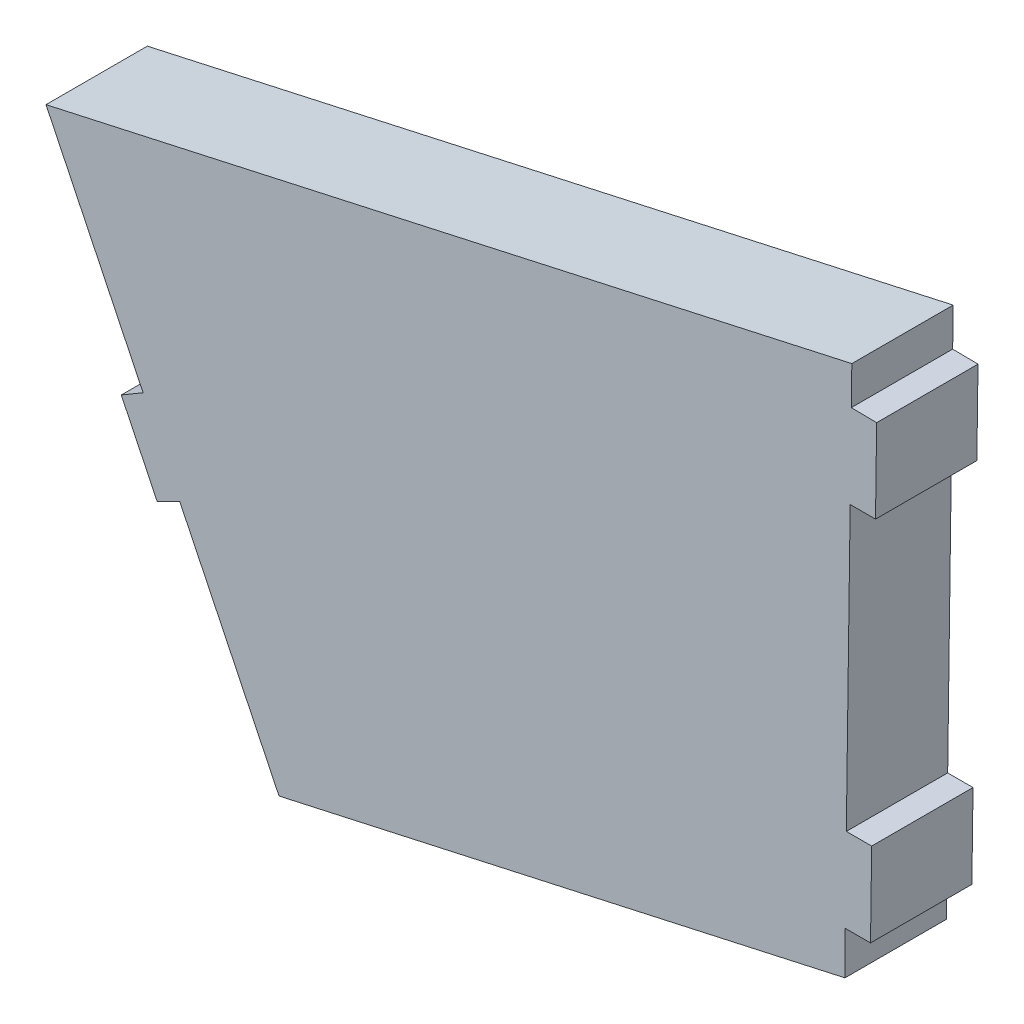
ISO-10303-21;
HEADER;
FILE_DESCRIPTION(('STEP AP214'),'2;1');
FILE_NAME('part.step','',(''),(''),'','','');
FILE_SCHEMA(('AUTOMOTIVE_DESIGN { 1 0 10303 214 1 1 1 1 }'));
ENDSEC;
DATA;
#1=APPLICATION_CONTEXT('core data for automotive mechanical design processes');
#2=APPLICATION_PROTOCOL_DEFINITION('international standard','automotive_design',2000,#1);
#3=PRODUCT_CONTEXT('',#1,'mechanical');
#4=PRODUCT('Part','Part','',(#3));
#5=PRODUCT_RELATED_PRODUCT_CATEGORY('part','',(#4));
#6=PRODUCT_DEFINITION_FORMATION('','',#4);
#7=PRODUCT_DEFINITION_CONTEXT('part definition',#1,'design');
#8=PRODUCT_DEFINITION('design','',#6,#7);
#9=PRODUCT_DEFINITION_SHAPE('','',#8);
#10=(LENGTH_UNIT() NAMED_UNIT(*) SI_UNIT(.MILLI.,.METRE.));
#11=(NAMED_UNIT(*) PLANE_ANGLE_UNIT() SI_UNIT($,.RADIAN.));
#12=(NAMED_UNIT(*) SI_UNIT($,.STERADIAN.) SOLID_ANGLE_UNIT());
#13=UNCERTAINTY_MEASURE_WITH_UNIT(LENGTH_MEASURE(1.E-05),#10,'distance_accuracy_value','');
#14=(GEOMETRIC_REPRESENTATION_CONTEXT(3) GLOBAL_UNCERTAINTY_ASSIGNED_CONTEXT((#13)) GLOBAL_UNIT_ASSIGNED_CONTEXT((#10,
#11,#12)) REPRESENTATION_CONTEXT('',''));
#15=CARTESIAN_POINT('',(0.,0.,0.));
#16=DIRECTION('',(0.,0.,1.));
#17=DIRECTION('',(1.,0.,0.));
#18=AXIS2_PLACEMENT_3D('',#15,#16,#17);
#19=CARTESIAN_POINT('',(-46.4576192800978,110.716729862106,6.));
#20=DIRECTION('',(-0.900391954449664,-0.435079680475098,0.));
#21=DIRECTION('',(0.435079680475098,-0.900391954449664,0.));
#22=AXIS2_PLACEMENT_3D('',#19,#20,#21);
#23=PLANE('',#22);
#24=DIRECTION('',(-0.435079680475098,0.900391954449664,0.));
#25=VECTOR('',#24,1.);
#26=CARTESIAN_POINT('',(-46.4576192800978,110.716729862106,0.));
#27=LINE('',#26,#25);
#28=CARTESIAN_POINT('',(-46.4576192800978,110.716729862106,0.));
#29=VERTEX_POINT('',#28);
#30=CARTESIAN_POINT('',(-52.2054470827535,122.611787575263,0.));
#31=VERTEX_POINT('',#30);
#32=EDGE_CURVE('E210',#29,#31,#27,.T.);
#33=ORIENTED_EDGE('',*,*,#32,.F.);
#34=DIRECTION('',(0.,0.,-1.));
#35=VECTOR('',#34,1.);
#36=CARTESIAN_POINT('',(-46.4576192800978,110.716729862106,6.));
#37=LINE('',#36,#35);
#38=CARTESIAN_POINT('',(-46.4576192800978,110.716729862106,6.));
#39=VERTEX_POINT('',#38);
#40=EDGE_CURVE('E11',#39,#29,#37,.T.);
#41=ORIENTED_EDGE('',*,*,#40,.F.);
#42=DIRECTION('',(-0.435079680475098,0.900391954449664,0.));
#43=VECTOR('',#42,1.);
#44=CARTESIAN_POINT('',(-46.4576192800978,110.716729862106,6.));
#45=LINE('',#44,#43);
#46=CARTESIAN_POINT('',(-52.2054470827535,122.611787575263,6.));
#47=VERTEX_POINT('',#46);
#48=EDGE_CURVE('E266',#39,#47,#45,.T.);
#49=ORIENTED_EDGE('',*,*,#48,.T.);
#50=DIRECTION('',(0.,0.,-1.));
#51=VECTOR('',#50,1.);
#52=CARTESIAN_POINT('',(-52.2054470827535,122.611787575263,6.));
#53=LINE('',#52,#51);
#54=EDGE_CURVE('E42',#47,#31,#53,.T.);
#55=ORIENTED_EDGE('',*,*,#54,.T.);
#56=EDGE_LOOP('',(#33,#41,#49,#55));
#57=FACE_BOUND('',#56,.T.);
#58=ADVANCED_FACE('F39',(#57),#23,.T.);
#59=CARTESIAN_POINT('',(-47.7493632714953,109.954235625611,6.));
#60=DIRECTION('',(-0.508329490996837,0.861162660931659,0.));
#61=DIRECTION('',(-0.86116266093166,-0.508329490996837,0.));
#62=AXIS2_PLACEMENT_3D('',#59,#60,#61);
#63=PLANE('',#62);
#64=DIRECTION('',(0.86116266093166,0.508329490996837,0.));
#65=VECTOR('',#64,1.);
#66=CARTESIAN_POINT('',(-47.7493632714953,109.954235625611,0.));
#67=LINE('',#66,#65);
#68=CARTESIAN_POINT('',(-47.7493632714953,109.954235625611,0.));
#69=VERTEX_POINT('',#68);
#70=EDGE_CURVE('E264',#69,#29,#67,.T.);
#71=ORIENTED_EDGE('',*,*,#70,.F.);
#72=DIRECTION('',(0.,0.,-1.));
#73=VECTOR('',#72,1.);
#74=CARTESIAN_POINT('',(-47.7493632714953,109.954235625611,6.));
#75=LINE('',#74,#73);
#76=CARTESIAN_POINT('',(-47.7493632714953,109.954235625611,6.));
#77=VERTEX_POINT('',#76);
#78=EDGE_CURVE('E49',#77,#69,#75,.T.);
#79=ORIENTED_EDGE('',*,*,#78,.F.);
#80=DIRECTION('',(0.86116266093166,0.508329490996837,0.));
#81=VECTOR('',#80,1.);
#82=CARTESIAN_POINT('',(-47.7493632714953,109.954235625611,6.));
#83=LINE('',#82,#81);
#84=EDGE_CURVE('E196',#77,#39,#83,.T.);
#85=ORIENTED_EDGE('',*,*,#84,.T.);
#86=ORIENTED_EDGE('',*,*,#40,.T.);
#87=EDGE_LOOP('',(#71,#79,#85,#86));
#88=FACE_BOUND('',#87,.T.);
#89=ADVANCED_FACE('F303',(#88),#63,.T.);
#90=CARTESIAN_POINT('',(-45.6281462630315,105.564403570073,6.));
#91=DIRECTION('',(-0.900391954449663,-0.4350796804751,0.));
#92=DIRECTION('',(0.4350796804751,-0.900391954449664,0.));
#93=AXIS2_PLACEMENT_3D('',#90,#91,#92);
#94=PLANE('',#93);
#95=DIRECTION('',(-0.4350796804751,0.900391954449663,0.));
#96=VECTOR('',#95,1.);
#97=CARTESIAN_POINT('',(-45.6281462630315,105.564403570073,0.));
#98=LINE('',#97,#96);
#99=CARTESIAN_POINT('',(-45.6281462630315,105.564403570073,0.));
#100=VERTEX_POINT('',#99);
#101=EDGE_CURVE('E182',#100,#69,#98,.T.);
#102=ORIENTED_EDGE('',*,*,#101,.F.);
#103=DIRECTION('',(0.,0.,-1.));
#104=VECTOR('',#103,1.);
#105=CARTESIAN_POINT('',(-45.6281462630315,105.564403570073,6.));
#106=LINE('',#105,#104);
#107=CARTESIAN_POINT('',(-45.6281462630315,105.564403570073,6.));
#108=VERTEX_POINT('',#107);
#109=EDGE_CURVE('E177',#108,#100,#106,.T.);
#110=ORIENTED_EDGE('',*,*,#109,.F.);
#111=DIRECTION('',(-0.4350796804751,0.900391954449663,0.));
#112=VECTOR('',#111,1.);
#113=CARTESIAN_POINT('',(-45.6281462630315,105.564403570073,6.));
#114=LINE('',#113,#112);
#115=EDGE_CURVE('E180',#108,#77,#114,.T.);
#116=ORIENTED_EDGE('',*,*,#115,.T.);
#117=ORIENTED_EDGE('',*,*,#78,.T.);
#118=EDGE_LOOP('',(#102,#110,#116,#117));
#119=FACE_BOUND('',#118,.T.);
#120=ADVANCED_FACE('F179',(#119),#94,.T.);
#121=CARTESIAN_POINT('',(-44.2822208797787,106.214770094113,6.));
#122=DIRECTION('',(0.435079680475107,-0.90039195444966,0.));
#123=DIRECTION('',(0.90039195444966,0.435079680475107,0.));
#124=AXIS2_PLACEMENT_3D('',#121,#122,#123);
#125=PLANE('',#124);
#126=DIRECTION('',(-0.90039195444966,-0.435079680475107,0.));
#127=VECTOR('',#126,1.);
#128=CARTESIAN_POINT('',(-44.2822208797787,106.214770094113,0.));
#129=LINE('',#128,#127);
#130=CARTESIAN_POINT('',(-44.2822208797787,106.214770094113,0.));
#131=VERTEX_POINT('',#130);
#132=EDGE_CURVE('E259',#131,#100,#129,.T.);
#133=ORIENTED_EDGE('',*,*,#132,.F.);
#134=DIRECTION('',(0.,0.,-1.));
#135=VECTOR('',#134,1.);
#136=CARTESIAN_POINT('',(-44.2822208797787,106.214770094113,6.));
#137=LINE('',#136,#135);
#138=CARTESIAN_POINT('',(-44.2822208797787,106.214770094113,6.));
#139=VERTEX_POINT('',#138);
#140=EDGE_CURVE('E188',#139,#131,#137,.T.);
#141=ORIENTED_EDGE('',*,*,#140,.F.);
#142=DIRECTION('',(-0.90039195444966,-0.435079680475107,0.));
#143=VECTOR('',#142,1.);
#144=CARTESIAN_POINT('',(-44.2822208797787,106.214770094113,6.));
#145=LINE('',#144,#143);
#146=EDGE_CURVE('E194',#139,#108,#145,.T.);
#147=ORIENTED_EDGE('',*,*,#146,.T.);
#148=ORIENTED_EDGE('',*,*,#109,.T.);
#149=EDGE_LOOP('',(#133,#141,#147,#148));
#150=FACE_BOUND('',#149,.T.);
#151=ADVANCED_FACE('F199',(#150),#125,.T.);
#152=CARTESIAN_POINT('',(-38.4111614331889,94.0646860358721,6.));
#153=DIRECTION('',(-0.900391954449664,-0.435079680475098,0.));
#154=DIRECTION('',(0.435079680475098,-0.900391954449664,0.));
#155=AXIS2_PLACEMENT_3D('',#152,#153,#154);
#156=PLANE('',#155);
#157=DIRECTION('',(-0.435079680475098,0.900391954449664,0.));
#158=VECTOR('',#157,1.);
#159=CARTESIAN_POINT('',(-38.4111614331889,94.0646860358721,0.));
#160=LINE('',#159,#158);
#161=CARTESIAN_POINT('',(-38.4111614331889,94.0646860358721,0.));
#162=VERTEX_POINT('',#161);
#163=EDGE_CURVE('E255',#162,#131,#160,.T.);
#164=ORIENTED_EDGE('',*,*,#163,.F.);
#165=DIRECTION('',(0.,0.,-1.));
#166=VECTOR('',#165,1.);
#167=CARTESIAN_POINT('',(-38.4111614331889,94.0646860358721,6.));
#168=LINE('',#167,#166);
#169=CARTESIAN_POINT('',(-38.4111614331889,94.0646860358721,6.));
#170=VERTEX_POINT('',#169);
#171=EDGE_CURVE('E271',#170,#162,#168,.T.);
#172=ORIENTED_EDGE('',*,*,#171,.F.);
#173=DIRECTION('',(-0.435079680475098,0.900391954449664,0.));
#174=VECTOR('',#173,1.);
#175=CARTESIAN_POINT('',(-38.4111614331889,94.0646860358721,6.));
#176=LINE('',#175,#174);
#177=EDGE_CURVE('E201',#170,#139,#176,.T.);
#178=ORIENTED_EDGE('',*,*,#177,.T.);
#179=ORIENTED_EDGE('',*,*,#140,.T.);
#180=EDGE_LOOP('',(#164,#172,#178,#179));
#181=FACE_BOUND('',#180,.T.);
#182=ADVANCED_FACE('F316',(#181),#156,.T.);
#183=CARTESIAN_POINT('',(-4.90943737691871,101.491773317277,6.));
#184=DIRECTION('',(0.216437777044072,-0.976296414347723,0.));
#185=DIRECTION('',(0.976296414347723,0.216437777044072,0.));
#186=AXIS2_PLACEMENT_3D('',#183,#184,#185);
#187=PLANE('',#186);
#188=DIRECTION('',(-0.976296414347723,-0.216437777044072,0.));
#189=VECTOR('',#188,1.);
#190=CARTESIAN_POINT('',(-4.90943737691871,101.491773317277,0.));
#191=LINE('',#190,#189);
#192=CARTESIAN_POINT('',(-4.90943737691871,101.491773317277,0.));
#193=VERTEX_POINT('',#192);
#194=EDGE_CURVE('E251',#193,#162,#191,.T.);
#195=ORIENTED_EDGE('',*,*,#194,.F.);
#196=DIRECTION('',(0.,0.,-1.));
#197=VECTOR('',#196,1.);
#198=CARTESIAN_POINT('',(-4.90943737691871,101.491773317277,6.));
#199=LINE('',#198,#197);
#200=CARTESIAN_POINT('',(-4.90943737691871,101.491773317277,6.));
#201=VERTEX_POINT('',#200);
#202=EDGE_CURVE('E274',#201,#193,#199,.T.);
#203=ORIENTED_EDGE('',*,*,#202,.F.);
#204=DIRECTION('',(-0.976296414347723,-0.216437777044072,0.));
#205=VECTOR('',#204,1.);
#206=CARTESIAN_POINT('',(-4.90943737691871,101.491773317277,6.));
#207=LINE('',#206,#205);
#208=EDGE_CURVE('E204',#201,#170,#207,.T.);
#209=ORIENTED_EDGE('',*,*,#208,.T.);
#210=ORIENTED_EDGE('',*,*,#171,.T.);
#211=EDGE_LOOP('',(#195,#203,#209,#210));
#212=FACE_BOUND('',#211,.T.);
#213=ADVANCED_FACE('F319',(#212),#187,.T.);
#214=CARTESIAN_POINT('',(-4.89690000953876,104.041117005893,6.));
#215=DIRECTION('',(0.999987907445494,-0.0049178209384357,0.));
#216=DIRECTION('',(0.0049178209384357,0.999987907445494,0.));
#217=AXIS2_PLACEMENT_3D('',#214,#215,#216);
#218=PLANE('',#217);
#219=DIRECTION('',(-0.0049178209384357,-0.999987907445494,0.));
#220=VECTOR('',#219,1.);
#221=CARTESIAN_POINT('',(-4.89690000953876,104.041117005893,0.));
#222=LINE('',#221,#220);
#223=CARTESIAN_POINT('',(-4.89690000953876,104.041117005893,0.));
#224=VERTEX_POINT('',#223);
#225=EDGE_CURVE('E247',#224,#193,#222,.T.);
#226=ORIENTED_EDGE('',*,*,#225,.F.);
#227=DIRECTION('',(0.,0.,-1.));
#228=VECTOR('',#227,1.);
#229=CARTESIAN_POINT('',(-4.89690000953876,104.041117005893,6.));
#230=LINE('',#229,#228);
#231=CARTESIAN_POINT('',(-4.89690000953876,104.041117005893,6.));
#232=VERTEX_POINT('',#231);
#233=EDGE_CURVE('E277',#232,#224,#230,.T.);
#234=ORIENTED_EDGE('',*,*,#233,.F.);
#235=DIRECTION('',(-0.0049178209384357,-0.999987907445494,0.));
#236=VECTOR('',#235,1.);
#237=CARTESIAN_POINT('',(-4.89690000953876,104.041117005893,6.));
#238=LINE('',#237,#236);
#239=EDGE_CURVE('E507',#232,#201,#238,.T.);
#240=ORIENTED_EDGE('',*,*,#239,.T.);
#241=ORIENTED_EDGE('',*,*,#202,.T.);
#242=EDGE_LOOP('',(#226,#234,#240,#241));
#243=FACE_BOUND('',#242,.T.);
#244=ADVANCED_FACE('F323',(#243),#218,.T.);
#245=CARTESIAN_POINT('',(-3.39690000953876,104.041117005893,6.));
#246=DIRECTION('',(0.,-1.,0.));
#247=DIRECTION('',(0.,0.,-1.));
#248=AXIS2_PLACEMENT_3D('',#245,#246,#247);
#249=PLANE('',#248);
#250=DIRECTION('',(-1.,0.,0.));
#251=VECTOR('',#250,1.);
#252=CARTESIAN_POINT('',(-3.39690000953876,104.041117005893,0.));
#253=LINE('',#252,#251);
#254=CARTESIAN_POINT('',(-3.39690000953876,104.041117005893,0.));
#255=VERTEX_POINT('',#254);
#256=EDGE_CURVE('E243',#255,#224,#253,.T.);
#257=ORIENTED_EDGE('',*,*,#256,.F.);
#258=DIRECTION('',(0.,0.,-1.));
#259=VECTOR('',#258,1.);
#260=CARTESIAN_POINT('',(-3.39690000953876,104.041117005893,6.));
#261=LINE('',#260,#259);
#262=CARTESIAN_POINT('',(-3.39690000953876,104.041117005893,6.));
#263=VERTEX_POINT('',#262);
#264=EDGE_CURVE('E280',#263,#255,#261,.T.);
#265=ORIENTED_EDGE('',*,*,#264,.F.);
#266=DIRECTION('',(-1.,0.,0.));
#267=VECTOR('',#266,1.);
#268=CARTESIAN_POINT('',(-3.39690000953876,104.041117005893,6.));
#269=LINE('',#268,#267);
#270=EDGE_CURVE('E503',#263,#232,#269,.T.);
#271=ORIENTED_EDGE('',*,*,#270,.T.);
#272=ORIENTED_EDGE('',*,*,#233,.T.);
#273=EDGE_LOOP('',(#257,#265,#271,#272));
#274=FACE_BOUND('',#273,.T.);
#275=ADVANCED_FACE('F327',(#274),#249,.T.);
#276=CARTESIAN_POINT('',(-3.32940100134408,109.040661367862,6.));
#277=DIRECTION('',(0.999908873525631,-0.0134998016542173,0.));
#278=DIRECTION('',(0.0134998016542173,0.999908873525631,0.));
#279=AXIS2_PLACEMENT_3D('',#276,#277,#278);
#280=PLANE('',#279);
#281=DIRECTION('',(-0.0134998016542173,-0.999908873525631,0.));
#282=VECTOR('',#281,1.);
#283=CARTESIAN_POINT('',(-3.32940100134408,109.040661367862,0.));
#284=LINE('',#283,#282);
#285=CARTESIAN_POINT('',(-3.32940100134408,109.040661367862,0.));
#286=VERTEX_POINT('',#285);
#287=EDGE_CURVE('E239',#286,#255,#284,.T.);
#288=ORIENTED_EDGE('',*,*,#287,.F.);
#289=DIRECTION('',(0.,0.,-1.));
#290=VECTOR('',#289,1.);
#291=CARTESIAN_POINT('',(-3.32940100134408,109.040661367862,6.));
#292=LINE('',#291,#290);
#293=CARTESIAN_POINT('',(-3.32940100134408,109.040661367862,6.));
#294=VERTEX_POINT('',#293);
#295=EDGE_CURVE('E283',#294,#286,#292,.T.);
#296=ORIENTED_EDGE('',*,*,#295,.F.);
#297=DIRECTION('',(-0.0134998016542173,-0.999908873525631,0.));
#298=VECTOR('',#297,1.);
#299=CARTESIAN_POINT('',(-3.32940100134408,109.040661367862,6.));
#300=LINE('',#299,#298);
#301=EDGE_CURVE('E517',#294,#263,#300,.T.);
#302=ORIENTED_EDGE('',*,*,#301,.T.);
#303=ORIENTED_EDGE('',*,*,#264,.T.);
#304=EDGE_LOOP('',(#288,#296,#302,#303));
#305=FACE_BOUND('',#304,.T.);
#306=ADVANCED_FACE('F331',(#305),#280,.T.);
#307=CARTESIAN_POINT('',(-4.82940100134408,109.040661367862,6.));
#308=DIRECTION('',(0.,1.,0.));
#309=DIRECTION('',(0.,0.,1.));
#310=AXIS2_PLACEMENT_3D('',#307,#308,#309);
#311=PLANE('',#310);
#312=DIRECTION('',(1.,0.,0.));
#313=VECTOR('',#312,1.);
#314=CARTESIAN_POINT('',(-4.82940100134408,109.040661367862,0.));
#315=LINE('',#314,#313);
#316=CARTESIAN_POINT('',(-4.82940100134408,109.040661367862,0.));
#317=VERTEX_POINT('',#316);
#318=EDGE_CURVE('E235',#317,#286,#315,.T.);
#319=ORIENTED_EDGE('',*,*,#318,.F.);
#320=DIRECTION('',(0.,0.,-1.));
#321=VECTOR('',#320,1.);
#322=CARTESIAN_POINT('',(-4.82940100134408,109.040661367862,6.));
#323=LINE('',#322,#321);
#324=CARTESIAN_POINT('',(-4.82940100134408,109.040661367862,6.));
#325=VERTEX_POINT('',#324);
#326=EDGE_CURVE('E286',#325,#317,#323,.T.);
#327=ORIENTED_EDGE('',*,*,#326,.F.);
#328=DIRECTION('',(1.,0.,0.));
#329=VECTOR('',#328,1.);
#330=CARTESIAN_POINT('',(-4.82940100134408,109.040661367862,6.));
#331=LINE('',#330,#329);
#332=EDGE_CURVE('E496',#325,#294,#331,.T.);
#333=ORIENTED_EDGE('',*,*,#332,.T.);
#334=ORIENTED_EDGE('',*,*,#295,.T.);
#335=EDGE_LOOP('',(#319,#327,#333,#334));
#336=FACE_BOUND('',#335,.T.);
#337=ADVANCED_FACE('F335',(#336),#311,.T.);
#338=CARTESIAN_POINT('',(-4.60159065077841,125.914212316697,6.));
#339=DIRECTION('',(0.999908873525631,-0.0134998016542173,0.));
#340=DIRECTION('',(0.0134998016542173,0.999908873525631,0.));
#341=AXIS2_PLACEMENT_3D('',#338,#339,#340);
#342=PLANE('',#341);
#343=DIRECTION('',(-0.0134998016542173,-0.999908873525631,0.));
#344=VECTOR('',#343,1.);
#345=CARTESIAN_POINT('',(-4.60159065077841,125.914212316697,0.));
#346=LINE('',#345,#344);
#347=CARTESIAN_POINT('',(-4.60159065077841,125.914212316697,0.));
#348=VERTEX_POINT('',#347);
#349=EDGE_CURVE('E231',#348,#317,#346,.T.);
#350=ORIENTED_EDGE('',*,*,#349,.F.);
#351=DIRECTION('',(0.,0.,-1.));
#352=VECTOR('',#351,1.);
#353=CARTESIAN_POINT('',(-4.60159065077841,125.914212316697,6.));
#354=LINE('',#353,#352);
#355=CARTESIAN_POINT('',(-4.60159065077841,125.914212316697,6.));
#356=VERTEX_POINT('',#355);
#357=EDGE_CURVE('E289',#356,#348,#354,.T.);
#358=ORIENTED_EDGE('',*,*,#357,.F.);
#359=DIRECTION('',(-0.0134998016542173,-0.999908873525631,0.));
#360=VECTOR('',#359,1.);
#361=CARTESIAN_POINT('',(-4.60159065077841,125.914212316697,6.));
#362=LINE('',#361,#360);
#363=EDGE_CURVE('E492',#356,#325,#362,.T.);
#364=ORIENTED_EDGE('',*,*,#363,.T.);
#365=ORIENTED_EDGE('',*,*,#326,.T.);
#366=EDGE_LOOP('',(#350,#358,#364,#365));
#367=FACE_BOUND('',#366,.T.);
#368=ADVANCED_FACE('F339',(#367),#342,.T.);
#369=CARTESIAN_POINT('',(-3.10159065077841,125.914212316697,6.));
#370=DIRECTION('',(0.,-1.,0.));
#371=DIRECTION('',(0.,0.,-1.));
#372=AXIS2_PLACEMENT_3D('',#369,#370,#371);
#373=PLANE('',#372);
#374=DIRECTION('',(-1.,0.,0.));
#375=VECTOR('',#374,1.);
#376=CARTESIAN_POINT('',(-3.10159065077841,125.914212316697,0.));
#377=LINE('',#376,#375);
#378=CARTESIAN_POINT('',(-3.10159065077841,125.914212316697,0.));
#379=VERTEX_POINT('',#378);
#380=EDGE_CURVE('E227',#379,#348,#377,.T.);
#381=ORIENTED_EDGE('',*,*,#380,.F.);
#382=DIRECTION('',(0.,0.,-1.));
#383=VECTOR('',#382,1.);
#384=CARTESIAN_POINT('',(-3.10159065077841,125.914212316697,6.));
#385=LINE('',#384,#383);
#386=CARTESIAN_POINT('',(-3.10159065077841,125.914212316697,6.));
#387=VERTEX_POINT('',#386);
#388=EDGE_CURVE('E292',#387,#379,#385,.T.);
#389=ORIENTED_EDGE('',*,*,#388,.F.);
#390=DIRECTION('',(-1.,0.,0.));
#391=VECTOR('',#390,1.);
#392=CARTESIAN_POINT('',(-3.10159065077841,125.914212316697,6.));
#393=LINE('',#392,#391);
#394=EDGE_CURVE('E524',#387,#356,#393,.T.);
#395=ORIENTED_EDGE('',*,*,#394,.T.);
#396=ORIENTED_EDGE('',*,*,#357,.T.);
#397=EDGE_LOOP('',(#381,#389,#395,#396));
#398=FACE_BOUND('',#397,.T.);
#399=ADVANCED_FACE('F343',(#398),#373,.T.);
#400=CARTESIAN_POINT('',(-3.03436489082269,130.89351761547,6.));
#401=DIRECTION('',(0.999908873525631,-0.0134998016542171,0.));
#402=DIRECTION('',(0.0134998016542171,0.999908873525631,0.));
#403=AXIS2_PLACEMENT_3D('',#400,#401,#402);
#404=PLANE('',#403);
#405=DIRECTION('',(-0.0134998016542171,-0.999908873525631,0.));
#406=VECTOR('',#405,1.);
#407=CARTESIAN_POINT('',(-3.03436489082269,130.89351761547,0.));
#408=LINE('',#407,#406);
#409=CARTESIAN_POINT('',(-3.03436489082269,130.89351761547,0.));
#410=VERTEX_POINT('',#409);
#411=EDGE_CURVE('E223',#410,#379,#408,.T.);
#412=ORIENTED_EDGE('',*,*,#411,.F.);
#413=DIRECTION('',(0.,0.,-1.));
#414=VECTOR('',#413,1.);
#415=CARTESIAN_POINT('',(-3.03436489082269,130.89351761547,6.));
#416=LINE('',#415,#414);
#417=CARTESIAN_POINT('',(-3.03436489082269,130.89351761547,6.));
#418=VERTEX_POINT('',#417);
#419=EDGE_CURVE('E295',#418,#410,#416,.T.);
#420=ORIENTED_EDGE('',*,*,#419,.F.);
#421=DIRECTION('',(-0.0134998016542171,-0.999908873525631,0.));
#422=VECTOR('',#421,1.);
#423=CARTESIAN_POINT('',(-3.03436489082269,130.89351761547,6.));
#424=LINE('',#423,#422);
#425=EDGE_CURVE('E485',#418,#387,#424,.T.);
#426=ORIENTED_EDGE('',*,*,#425,.T.);
#427=ORIENTED_EDGE('',*,*,#388,.T.);
#428=EDGE_LOOP('',(#412,#420,#426,#427));
#429=FACE_BOUND('',#428,.T.);
#430=ADVANCED_FACE('F347',(#429),#404,.T.);
#431=CARTESIAN_POINT('',(-4.53409164263169,130.913756675113,6.));
#432=DIRECTION('',(0.0134939360834337,0.999908952699682,0.));
#433=DIRECTION('',(-0.999908952699683,0.0134939360834337,0.));
#434=AXIS2_PLACEMENT_3D('',#431,#432,#433);
#435=PLANE('',#434);
#436=DIRECTION('',(0.999908952699683,-0.0134939360834337,0.));
#437=VECTOR('',#436,1.);
#438=CARTESIAN_POINT('',(-4.53409164263169,130.913756675113,0.));
#439=LINE('',#438,#437);
#440=CARTESIAN_POINT('',(-4.53409164263169,130.913756675113,0.));
#441=VERTEX_POINT('',#440);
#442=EDGE_CURVE('E220',#441,#410,#439,.T.);
#443=ORIENTED_EDGE('',*,*,#442,.F.);
#444=DIRECTION('',(0.,0.,-1.));
#445=VECTOR('',#444,1.);
#446=CARTESIAN_POINT('',(-4.53409164263169,130.913756675113,6.));
#447=LINE('',#446,#445);
#448=CARTESIAN_POINT('',(-4.53409164263169,130.913756675113,6.));
#449=VERTEX_POINT('',#448);
#450=EDGE_CURVE('E297',#449,#441,#447,.T.);
#451=ORIENTED_EDGE('',*,*,#450,.F.);
#452=DIRECTION('',(0.999908952699683,-0.0134939360834337,0.));
#453=VECTOR('',#452,1.);
#454=CARTESIAN_POINT('',(-4.53409164263169,130.913756675113,6.));
#455=LINE('',#454,#453);
#456=EDGE_CURVE('E481',#449,#418,#455,.T.);
#457=ORIENTED_EDGE('',*,*,#456,.T.);
#458=ORIENTED_EDGE('',*,*,#419,.T.);
#459=EDGE_LOOP('',(#443,#451,#457,#458));
#460=FACE_BOUND('',#459,.T.);
#461=ADVANCED_FACE('F351',(#460),#435,.T.);
#462=CARTESIAN_POINT('',(-4.50340074836227,133.186982482608,6.));
#463=DIRECTION('',(0.999908873525631,-0.0134998016542172,0.));
#464=DIRECTION('',(0.0134998016542172,0.999908873525631,0.));
#465=AXIS2_PLACEMENT_3D('',#462,#463,#464);
#466=PLANE('',#465);
#467=DIRECTION('',(-0.0134998016542172,-0.999908873525631,0.));
#468=VECTOR('',#467,1.);
#469=CARTESIAN_POINT('',(-4.50340074836227,133.186982482608,0.));
#470=LINE('',#469,#468);
#471=CARTESIAN_POINT('',(-4.50340074836227,133.186982482608,0.));
#472=VERTEX_POINT('',#471);
#473=EDGE_CURVE('E217',#472,#441,#470,.T.);
#474=ORIENTED_EDGE('',*,*,#473,.F.);
#475=DIRECTION('',(0.,0.,-1.));
#476=VECTOR('',#475,1.);
#477=CARTESIAN_POINT('',(-4.50340074836227,133.186982482608,6.));
#478=LINE('',#477,#476);
#479=CARTESIAN_POINT('',(-4.50340074836227,133.186982482608,6.));
#480=VERTEX_POINT('',#479);
#481=EDGE_CURVE('E298',#480,#472,#478,.T.);
#482=ORIENTED_EDGE('',*,*,#481,.F.);
#483=DIRECTION('',(-0.0134998016542172,-0.999908873525631,0.));
#484=VECTOR('',#483,1.);
#485=CARTESIAN_POINT('',(-4.50340074836227,133.186982482608,6.));
#486=LINE('',#485,#484);
#487=EDGE_CURVE('E530',#480,#449,#486,.T.);
#488=ORIENTED_EDGE('',*,*,#487,.T.);
#489=ORIENTED_EDGE('',*,*,#450,.T.);
#490=EDGE_LOOP('',(#474,#482,#488,#489));
#491=FACE_BOUND('',#490,.T.);
#492=ADVANCED_FACE('F355',(#491),#466,.T.);
#493=CARTESIAN_POINT('',(-52.2054470827535,122.611787575263,6.));
#494=DIRECTION('',(-0.216437777044071,0.976296414347723,0.));
#495=DIRECTION('',(-0.976296414347723,-0.216437777044071,0.));
#496=AXIS2_PLACEMENT_3D('',#493,#494,#495);
#497=PLANE('',#496);
#498=DIRECTION('',(0.976296414347723,0.216437777044071,0.));
#499=VECTOR('',#498,1.);
#500=CARTESIAN_POINT('',(-52.2054470827535,122.611787575263,0.));
#501=LINE('',#500,#499);
#502=EDGE_CURVE('E213',#31,#472,#501,.T.);
#503=ORIENTED_EDGE('',*,*,#502,.F.);
#504=ORIENTED_EDGE('',*,*,#54,.F.);
#505=DIRECTION('',(0.976296414347723,0.216437777044071,0.));
#506=VECTOR('',#505,1.);
#507=CARTESIAN_POINT('',(-52.2054470827535,122.611787575263,6.));
#508=LINE('',#507,#506);
#509=EDGE_CURVE('E532',#47,#480,#508,.T.);
#510=ORIENTED_EDGE('',*,*,#509,.T.);
#511=ORIENTED_EDGE('',*,*,#481,.T.);
#512=EDGE_LOOP('',(#503,#504,#510,#511));
#513=FACE_BOUND('',#512,.T.);
#514=ADVANCED_FACE('F300',(#513),#497,.T.);
#515=CARTESIAN_POINT('',(0.,0.,6.));
#516=DIRECTION('',(0.,0.,1.));
#517=DIRECTION('',(1.,0.,0.));
#518=AXIS2_PLACEMENT_3D('',#515,#516,#517);
#519=PLANE('',#518);
#520=ORIENTED_EDGE('',*,*,#48,.F.);
#521=ORIENTED_EDGE('',*,*,#84,.F.);
#522=ORIENTED_EDGE('',*,*,#115,.F.);
#523=ORIENTED_EDGE('',*,*,#146,.F.);
#524=ORIENTED_EDGE('',*,*,#177,.F.);
#525=ORIENTED_EDGE('',*,*,#208,.F.);
#526=ORIENTED_EDGE('',*,*,#239,.F.);
#527=ORIENTED_EDGE('',*,*,#270,.F.);
#528=ORIENTED_EDGE('',*,*,#301,.F.);
#529=ORIENTED_EDGE('',*,*,#332,.F.);
#530=ORIENTED_EDGE('',*,*,#363,.F.);
#531=ORIENTED_EDGE('',*,*,#394,.F.);
#532=ORIENTED_EDGE('',*,*,#425,.F.);
#533=ORIENTED_EDGE('',*,*,#456,.F.);
#534=ORIENTED_EDGE('',*,*,#487,.F.);
#535=ORIENTED_EDGE('',*,*,#509,.F.);
#536=EDGE_LOOP('',(#520,#521,#522,#523,#524,#525,#526,#527,#528,#529,#530,#531,#532,#533,#534,#535));
#537=FACE_BOUND('',#536,.T.);
#538=ADVANCED_FACE('F192',(#537),#519,.T.);
#539=CARTESIAN_POINT('',(0.,0.,0.));
#540=DIRECTION('',(0.,0.,1.));
#541=DIRECTION('',(1.,0.,0.));
#542=AXIS2_PLACEMENT_3D('',#539,#540,#541);
#543=PLANE('',#542);
#544=ORIENTED_EDGE('',*,*,#32,.T.);
#545=ORIENTED_EDGE('',*,*,#502,.T.);
#546=ORIENTED_EDGE('',*,*,#473,.T.);
#547=ORIENTED_EDGE('',*,*,#442,.T.);
#548=ORIENTED_EDGE('',*,*,#411,.T.);
#549=ORIENTED_EDGE('',*,*,#380,.T.);
#550=ORIENTED_EDGE('',*,*,#349,.T.);
#551=ORIENTED_EDGE('',*,*,#318,.T.);
#552=ORIENTED_EDGE('',*,*,#287,.T.);
#553=ORIENTED_EDGE('',*,*,#256,.T.);
#554=ORIENTED_EDGE('',*,*,#225,.T.);
#555=ORIENTED_EDGE('',*,*,#194,.T.);
#556=ORIENTED_EDGE('',*,*,#163,.T.);
#557=ORIENTED_EDGE('',*,*,#132,.T.);
#558=ORIENTED_EDGE('',*,*,#101,.T.);
#559=ORIENTED_EDGE('',*,*,#70,.T.);
#560=EDGE_LOOP('',(#544,#545,#546,#547,#548,#549,#550,#551,#552,#553,#554,#555,#556,#557,#558,#559));
#561=FACE_BOUND('',#560,.T.);
#562=ADVANCED_FACE('F302',(#561),#543,.F.);
#563=CLOSED_SHELL('',(#58,#89,#120,#151,#182,#213,#244,#275,#306,#337,#368,#399,#430,#461,#492,
#514,#538,#562));
#564=MANIFOLD_SOLID_BREP('B2',#563);
#565=ADVANCED_BREP_SHAPE_REPRESENTATION('',(#18,#564),#14);
#566=SHAPE_DEFINITION_REPRESENTATION(#9,#565);
ENDSEC;
END-ISO-10303-21;
